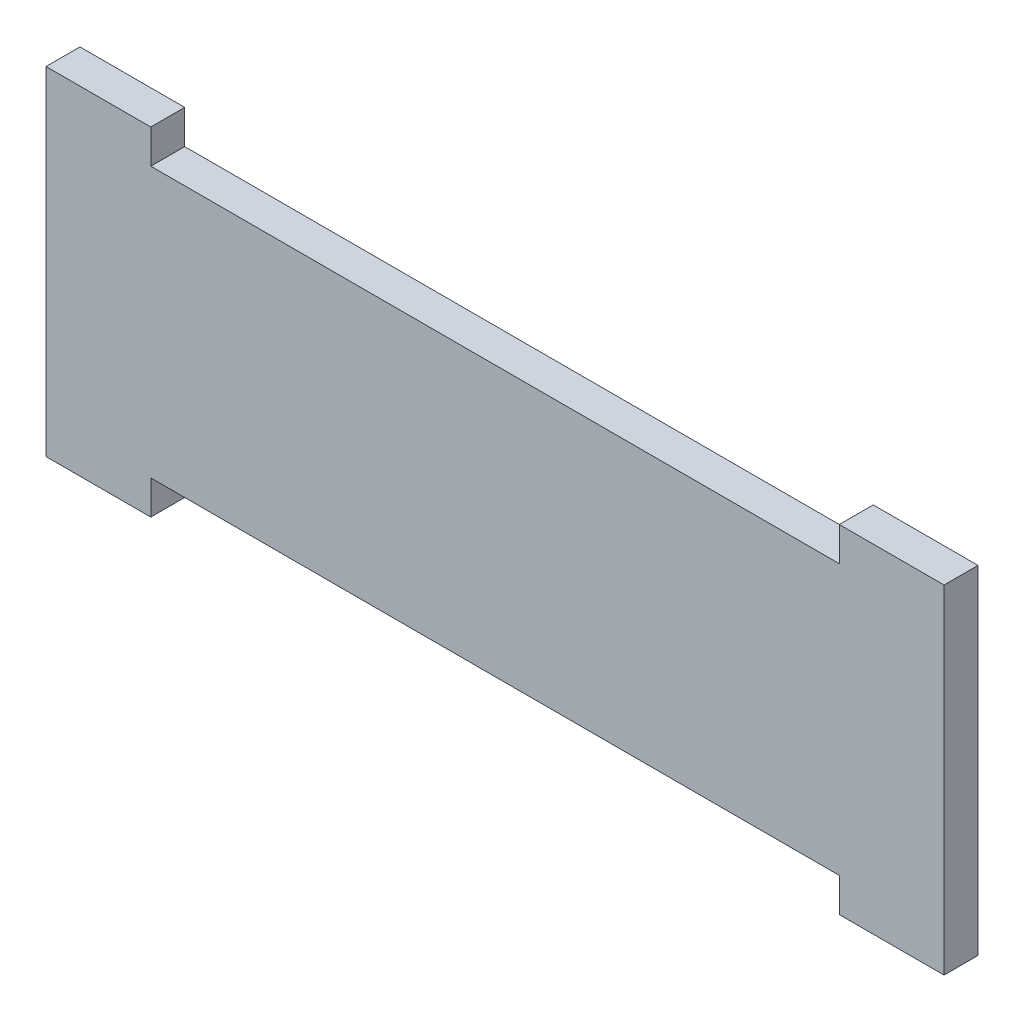
ISO-10303-21;
HEADER;
FILE_DESCRIPTION(('STEP AP214'),'2;1');
FILE_NAME('part.step','',(''),(''),'','','');
FILE_SCHEMA(('AUTOMOTIVE_DESIGN { 1 0 10303 214 1 1 1 1 }'));
ENDSEC;
DATA;
#1=APPLICATION_CONTEXT('core data for automotive mechanical design processes');
#2=APPLICATION_PROTOCOL_DEFINITION('international standard','automotive_design',2000,#1);
#3=PRODUCT_CONTEXT('',#1,'mechanical');
#4=PRODUCT('Part','Part','',(#3));
#5=PRODUCT_RELATED_PRODUCT_CATEGORY('part','',(#4));
#6=PRODUCT_DEFINITION_FORMATION('','',#4);
#7=PRODUCT_DEFINITION_CONTEXT('part definition',#1,'design');
#8=PRODUCT_DEFINITION('design','',#6,#7);
#9=PRODUCT_DEFINITION_SHAPE('','',#8);
#10=(LENGTH_UNIT() NAMED_UNIT(*) SI_UNIT(.MILLI.,.METRE.));
#11=(NAMED_UNIT(*) PLANE_ANGLE_UNIT() SI_UNIT($,.RADIAN.));
#12=(NAMED_UNIT(*) SI_UNIT($,.STERADIAN.) SOLID_ANGLE_UNIT());
#13=UNCERTAINTY_MEASURE_WITH_UNIT(LENGTH_MEASURE(1.E-05),#10,'distance_accuracy_value','');
#14=(GEOMETRIC_REPRESENTATION_CONTEXT(3) GLOBAL_UNCERTAINTY_ASSIGNED_CONTEXT((#13)) GLOBAL_UNIT_ASSIGNED_CONTEXT((#10,
#11,#12)) REPRESENTATION_CONTEXT('',''));
#15=CARTESIAN_POINT('',(0.,0.,0.));
#16=DIRECTION('',(0.,0.,1.));
#17=DIRECTION('',(1.,0.,0.));
#18=AXIS2_PLACEMENT_3D('',#15,#16,#17);
#19=CARTESIAN_POINT('',(-9.00000000000005,0.,1.5875));
#20=DIRECTION('',(1.,0.,0.));
#21=DIRECTION('',(0.,1.,0.));
#22=AXIS2_PLACEMENT_3D('',#19,#20,#21);
#23=PLANE('',#22);
#24=DIRECTION('',(0.,-1.,0.));
#25=VECTOR('',#24,1.);
#26=CARTESIAN_POINT('',(-9.00000000000005,0.,0.));
#27=LINE('',#26,#25);
#28=CARTESIAN_POINT('',(-9.00000000000004,0.,0.));
#29=VERTEX_POINT('',#28);
#30=CARTESIAN_POINT('',(-9.,-15.8,0.));
#31=VERTEX_POINT('',#30);
#32=EDGE_CURVE('E155',#29,#31,#27,.T.);
#33=ORIENTED_EDGE('',*,*,#32,.F.);
#34=DIRECTION('',(0.,0.,-1.));
#35=VECTOR('',#34,1.);
#36=CARTESIAN_POINT('',(-9.00000000000004,0.,1.5875));
#37=LINE('',#36,#35);
#38=CARTESIAN_POINT('',(-9.00000000000004,0.,1.5875));
#39=VERTEX_POINT('',#38);
#40=EDGE_CURVE('E11',#39,#29,#37,.T.);
#41=ORIENTED_EDGE('',*,*,#40,.F.);
#42=DIRECTION('',(0.,-1.,0.));
#43=VECTOR('',#42,1.);
#44=CARTESIAN_POINT('',(-9.00000000000005,0.,1.5875));
#45=LINE('',#44,#43);
#46=CARTESIAN_POINT('',(-9.,-15.8,1.5875));
#47=VERTEX_POINT('',#46);
#48=EDGE_CURVE('E184',#39,#47,#45,.T.);
#49=ORIENTED_EDGE('',*,*,#48,.T.);
#50=DIRECTION('',(0.,0.,-1.));
#51=VECTOR('',#50,1.);
#52=CARTESIAN_POINT('',(-9.,-15.8,1.5875));
#53=LINE('',#52,#51);
#54=EDGE_CURVE('E53',#47,#31,#53,.T.);
#55=ORIENTED_EDGE('',*,*,#54,.T.);
#56=EDGE_LOOP('',(#33,#41,#49,#55));
#57=FACE_BOUND('',#56,.T.);
#58=ADVANCED_FACE('F37',(#57),#23,.T.);
#59=CARTESIAN_POINT('',(0.,0.,1.5875));
#60=DIRECTION('',(0.,-1.,0.));
#61=DIRECTION('',(1.,0.,0.));
#62=AXIS2_PLACEMENT_3D('',#59,#60,#61);
#63=PLANE('',#62);
#64=DIRECTION('',(-1.,0.,0.));
#65=VECTOR('',#64,1.);
#66=CARTESIAN_POINT('',(0.,0.,0.));
#67=LINE('',#66,#65);
#68=CARTESIAN_POINT('',(-13.9,0.,0.));
#69=VERTEX_POINT('',#68);
#70=EDGE_CURVE('E157',#29,#69,#67,.T.);
#71=ORIENTED_EDGE('',*,*,#70,.T.);
#72=DIRECTION('',(0.,0.,-1.));
#73=VECTOR('',#72,1.);
#74=CARTESIAN_POINT('',(-13.9,0.,1.5875));
#75=LINE('',#74,#73);
#76=CARTESIAN_POINT('',(-13.9,0.,1.5875));
#77=VERTEX_POINT('',#76);
#78=EDGE_CURVE('E45',#77,#69,#75,.T.);
#79=ORIENTED_EDGE('',*,*,#78,.F.);
#80=DIRECTION('',(-1.,0.,0.));
#81=VECTOR('',#80,1.);
#82=CARTESIAN_POINT('',(0.,0.,1.5875));
#83=LINE('',#82,#81);
#84=EDGE_CURVE('E226',#39,#77,#83,.T.);
#85=ORIENTED_EDGE('',*,*,#84,.F.);
#86=ORIENTED_EDGE('',*,*,#40,.T.);
#87=EDGE_LOOP('',(#71,#79,#85,#86));
#88=FACE_BOUND('',#87,.T.);
#89=ADVANCED_FACE('F250',(#88),#63,.F.);
#90=CARTESIAN_POINT('',(-13.9,0.,1.5875));
#91=DIRECTION('',(1.,0.,0.));
#92=DIRECTION('',(0.,0.,-1.));
#93=AXIS2_PLACEMENT_3D('',#90,#91,#92);
#94=PLANE('',#93);
#95=DIRECTION('',(0.,-1.,0.));
#96=VECTOR('',#95,1.);
#97=CARTESIAN_POINT('',(-13.9,0.,0.));
#98=LINE('',#97,#96);
#99=CARTESIAN_POINT('',(-13.9,-1.58750000000001,0.));
#100=VERTEX_POINT('',#99);
#101=EDGE_CURVE('E159',#69,#100,#98,.T.);
#102=ORIENTED_EDGE('',*,*,#101,.T.);
#103=DIRECTION('',(0.,0.,-1.));
#104=VECTOR('',#103,1.);
#105=CARTESIAN_POINT('',(-13.9,-1.58750000000001,1.5875));
#106=LINE('',#105,#104);
#107=CARTESIAN_POINT('',(-13.9,-1.58750000000001,1.5875));
#108=VERTEX_POINT('',#107);
#109=EDGE_CURVE('E200',#108,#100,#106,.T.);
#110=ORIENTED_EDGE('',*,*,#109,.F.);
#111=DIRECTION('',(0.,-1.,0.));
#112=VECTOR('',#111,1.);
#113=CARTESIAN_POINT('',(-13.9,0.,1.5875));
#114=LINE('',#113,#112);
#115=EDGE_CURVE('E208',#77,#108,#114,.T.);
#116=ORIENTED_EDGE('',*,*,#115,.F.);
#117=ORIENTED_EDGE('',*,*,#78,.T.);
#118=EDGE_LOOP('',(#102,#110,#116,#117));
#119=FACE_BOUND('',#118,.T.);
#120=ADVANCED_FACE('F206',(#119),#94,.F.);
#121=CARTESIAN_POINT('',(0.,-1.58749999999993,1.5875));
#122=DIRECTION('',(0.,1.,0.));
#123=DIRECTION('',(-1.,0.,0.));
#124=AXIS2_PLACEMENT_3D('',#121,#122,#123);
#125=PLANE('',#124);
#126=DIRECTION('',(1.,0.,0.));
#127=VECTOR('',#126,1.);
#128=CARTESIAN_POINT('',(0.,-1.58749999999993,0.));
#129=LINE('',#128,#127);
#130=CARTESIAN_POINT('',(-46.1,-1.58750000000011,0.));
#131=VERTEX_POINT('',#130);
#132=EDGE_CURVE('E162',#131,#100,#129,.T.);
#133=ORIENTED_EDGE('',*,*,#132,.F.);
#134=DIRECTION('',(0.,0.,-1.));
#135=VECTOR('',#134,1.);
#136=CARTESIAN_POINT('',(-46.1,-1.58750000000011,1.5875));
#137=LINE('',#136,#135);
#138=CARTESIAN_POINT('',(-46.1,-1.58750000000011,1.5875));
#139=VERTEX_POINT('',#138);
#140=EDGE_CURVE('E198',#139,#131,#137,.T.);
#141=ORIENTED_EDGE('',*,*,#140,.F.);
#142=DIRECTION('',(1.,0.,0.));
#143=VECTOR('',#142,1.);
#144=CARTESIAN_POINT('',(0.,-1.58749999999993,1.5875));
#145=LINE('',#144,#143);
#146=EDGE_CURVE('E221',#139,#108,#145,.T.);
#147=ORIENTED_EDGE('',*,*,#146,.T.);
#148=ORIENTED_EDGE('',*,*,#109,.T.);
#149=EDGE_LOOP('',(#133,#141,#147,#148));
#150=FACE_BOUND('',#149,.T.);
#151=ADVANCED_FACE('F217',(#150),#125,.T.);
#152=CARTESIAN_POINT('',(-46.1,0.,1.5875));
#153=DIRECTION('',(-1.,0.,0.));
#154=DIRECTION('',(0.,0.,1.));
#155=AXIS2_PLACEMENT_3D('',#152,#153,#154);
#156=PLANE('',#155);
#157=DIRECTION('',(0.,1.,0.));
#158=VECTOR('',#157,1.);
#159=CARTESIAN_POINT('',(-46.1,0.,0.));
#160=LINE('',#159,#158);
#161=CARTESIAN_POINT('',(-46.1,0.,0.));
#162=VERTEX_POINT('',#161);
#163=EDGE_CURVE('E165',#131,#162,#160,.T.);
#164=ORIENTED_EDGE('',*,*,#163,.T.);
#165=DIRECTION('',(0.,0.,-1.));
#166=VECTOR('',#165,1.);
#167=CARTESIAN_POINT('',(-46.1,0.,1.5875));
#168=LINE('',#167,#166);
#169=CARTESIAN_POINT('',(-46.1,0.,1.5875));
#170=VERTEX_POINT('',#169);
#171=EDGE_CURVE('E195',#170,#162,#168,.T.);
#172=ORIENTED_EDGE('',*,*,#171,.F.);
#173=DIRECTION('',(0.,1.,0.));
#174=VECTOR('',#173,1.);
#175=CARTESIAN_POINT('',(-46.1,0.,1.5875));
#176=LINE('',#175,#174);
#177=EDGE_CURVE('E222',#139,#170,#176,.T.);
#178=ORIENTED_EDGE('',*,*,#177,.F.);
#179=ORIENTED_EDGE('',*,*,#140,.T.);
#180=EDGE_LOOP('',(#164,#172,#178,#179));
#181=FACE_BOUND('',#180,.T.);
#182=ADVANCED_FACE('F261',(#181),#156,.F.);
#183=CARTESIAN_POINT('',(0.,-3.08877976342309E-13,1.5875));
#184=DIRECTION('',(0.,-1.,0.));
#185=DIRECTION('',(1.,0.,0.));
#186=AXIS2_PLACEMENT_3D('',#183,#184,#185);
#187=PLANE('',#186);
#188=DIRECTION('',(-1.,0.,0.));
#189=VECTOR('',#188,1.);
#190=CARTESIAN_POINT('',(0.,-3.08877976342309E-13,0.));
#191=LINE('',#190,#189);
#192=CARTESIAN_POINT('',(-51.,0.,0.));
#193=VERTEX_POINT('',#192);
#194=EDGE_CURVE('E167',#162,#193,#191,.T.);
#195=ORIENTED_EDGE('',*,*,#194,.T.);
#196=DIRECTION('',(0.,0.,-1.));
#197=VECTOR('',#196,1.);
#198=CARTESIAN_POINT('',(-51.,0.,1.5875));
#199=LINE('',#198,#197);
#200=CARTESIAN_POINT('',(-51.,0.,1.5875));
#201=VERTEX_POINT('',#200);
#202=EDGE_CURVE('E192',#201,#193,#199,.T.);
#203=ORIENTED_EDGE('',*,*,#202,.F.);
#204=DIRECTION('',(-1.,0.,0.));
#205=VECTOR('',#204,1.);
#206=CARTESIAN_POINT('',(0.,-3.08877976342309E-13,1.5875));
#207=LINE('',#206,#205);
#208=EDGE_CURVE('E224',#170,#201,#207,.T.);
#209=ORIENTED_EDGE('',*,*,#208,.F.);
#210=ORIENTED_EDGE('',*,*,#171,.T.);
#211=EDGE_LOOP('',(#195,#203,#209,#210));
#212=FACE_BOUND('',#211,.T.);
#213=ADVANCED_FACE('F264',(#212),#187,.F.);
#214=CARTESIAN_POINT('',(-51.,0.,1.5875));
#215=DIRECTION('',(1.,0.,0.));
#216=DIRECTION('',(0.,0.,-1.));
#217=AXIS2_PLACEMENT_3D('',#214,#215,#216);
#218=PLANE('',#217);
#219=DIRECTION('',(0.,-1.,0.));
#220=VECTOR('',#219,1.);
#221=CARTESIAN_POINT('',(-51.,0.,0.));
#222=LINE('',#221,#220);
#223=CARTESIAN_POINT('',(-51.,-15.8,0.));
#224=VERTEX_POINT('',#223);
#225=EDGE_CURVE('E169',#193,#224,#222,.T.);
#226=ORIENTED_EDGE('',*,*,#225,.T.);
#227=DIRECTION('',(0.,0.,-1.));
#228=VECTOR('',#227,1.);
#229=CARTESIAN_POINT('',(-51.,-15.8,1.5875));
#230=LINE('',#229,#228);
#231=CARTESIAN_POINT('',(-51.,-15.8,1.5875));
#232=VERTEX_POINT('',#231);
#233=EDGE_CURVE('E190',#232,#224,#230,.T.);
#234=ORIENTED_EDGE('',*,*,#233,.F.);
#235=DIRECTION('',(0.,-1.,0.));
#236=VECTOR('',#235,1.);
#237=CARTESIAN_POINT('',(-51.,0.,1.5875));
#238=LINE('',#237,#236);
#239=EDGE_CURVE('E231',#201,#232,#238,.T.);
#240=ORIENTED_EDGE('',*,*,#239,.F.);
#241=ORIENTED_EDGE('',*,*,#202,.T.);
#242=EDGE_LOOP('',(#226,#234,#240,#241));
#243=FACE_BOUND('',#242,.T.);
#244=ADVANCED_FACE('F268',(#243),#218,.F.);
#245=CARTESIAN_POINT('',(0.,-15.7999999999999,1.5875));
#246=DIRECTION('',(0.,-1.,0.));
#247=DIRECTION('',(1.,0.,0.));
#248=AXIS2_PLACEMENT_3D('',#245,#246,#247);
#249=PLANE('',#248);
#250=DIRECTION('',(-1.,0.,0.));
#251=VECTOR('',#250,1.);
#252=CARTESIAN_POINT('',(0.,-15.7999999999999,0.));
#253=LINE('',#252,#251);
#254=CARTESIAN_POINT('',(-46.1,-15.8,0.));
#255=VERTEX_POINT('',#254);
#256=EDGE_CURVE('E172',#255,#224,#253,.T.);
#257=ORIENTED_EDGE('',*,*,#256,.F.);
#258=DIRECTION('',(0.,0.,-1.));
#259=VECTOR('',#258,1.);
#260=CARTESIAN_POINT('',(-46.1,-15.8,1.5875));
#261=LINE('',#260,#259);
#262=CARTESIAN_POINT('',(-46.1,-15.8,1.5875));
#263=VERTEX_POINT('',#262);
#264=EDGE_CURVE('E188',#263,#255,#261,.T.);
#265=ORIENTED_EDGE('',*,*,#264,.F.);
#266=DIRECTION('',(-1.,0.,0.));
#267=VECTOR('',#266,1.);
#268=CARTESIAN_POINT('',(0.,-15.7999999999999,1.5875));
#269=LINE('',#268,#267);
#270=EDGE_CURVE('E233',#263,#232,#269,.T.);
#271=ORIENTED_EDGE('',*,*,#270,.T.);
#272=ORIENTED_EDGE('',*,*,#233,.T.);
#273=EDGE_LOOP('',(#257,#265,#271,#272));
#274=FACE_BOUND('',#273,.T.);
#275=ADVANCED_FACE('F272',(#274),#249,.T.);
#276=CARTESIAN_POINT('',(-46.1,0.,1.5875));
#277=DIRECTION('',(1.,0.,0.));
#278=DIRECTION('',(0.,0.,-1.));
#279=AXIS2_PLACEMENT_3D('',#276,#277,#278);
#280=PLANE('',#279);
#281=DIRECTION('',(0.,-1.,0.));
#282=VECTOR('',#281,1.);
#283=CARTESIAN_POINT('',(-46.1,0.,0.));
#284=LINE('',#283,#282);
#285=CARTESIAN_POINT('',(-46.1,-14.2125,0.));
#286=VERTEX_POINT('',#285);
#287=EDGE_CURVE('E175',#286,#255,#284,.T.);
#288=ORIENTED_EDGE('',*,*,#287,.F.);
#289=DIRECTION('',(0.,0.,-1.));
#290=VECTOR('',#289,1.);
#291=CARTESIAN_POINT('',(-46.1,-14.2125,1.5875));
#292=LINE('',#291,#290);
#293=CARTESIAN_POINT('',(-46.1,-14.2125,1.5875));
#294=VERTEX_POINT('',#293);
#295=EDGE_CURVE('E136',#294,#286,#292,.T.);
#296=ORIENTED_EDGE('',*,*,#295,.F.);
#297=DIRECTION('',(0.,-1.,0.));
#298=VECTOR('',#297,1.);
#299=CARTESIAN_POINT('',(-46.1,0.,1.5875));
#300=LINE('',#299,#298);
#301=EDGE_CURVE('E147',#294,#263,#300,.T.);
#302=ORIENTED_EDGE('',*,*,#301,.T.);
#303=ORIENTED_EDGE('',*,*,#264,.T.);
#304=EDGE_LOOP('',(#288,#296,#302,#303));
#305=FACE_BOUND('',#304,.T.);
#306=ADVANCED_FACE('F237',(#305),#280,.T.);
#307=CARTESIAN_POINT('',(0.,-14.2125,1.5875));
#308=DIRECTION('',(0.,-1.,0.));
#309=DIRECTION('',(0.,0.,-1.));
#310=AXIS2_PLACEMENT_3D('',#307,#308,#309);
#311=PLANE('',#310);
#312=DIRECTION('',(-1.,0.,0.));
#313=VECTOR('',#312,1.);
#314=CARTESIAN_POINT('',(0.,-14.2125,0.));
#315=LINE('',#314,#313);
#316=CARTESIAN_POINT('',(-13.9,-14.2125,0.));
#317=VERTEX_POINT('',#316);
#318=EDGE_CURVE('E132',#317,#286,#315,.T.);
#319=ORIENTED_EDGE('',*,*,#318,.F.);
#320=DIRECTION('',(0.,0.,-1.));
#321=VECTOR('',#320,1.);
#322=CARTESIAN_POINT('',(-13.9,-14.2125,1.5875));
#323=LINE('',#322,#321);
#324=CARTESIAN_POINT('',(-13.9,-14.2125,1.5875));
#325=VERTEX_POINT('',#324);
#326=EDGE_CURVE('E127',#325,#317,#323,.T.);
#327=ORIENTED_EDGE('',*,*,#326,.F.);
#328=DIRECTION('',(-1.,0.,0.));
#329=VECTOR('',#328,1.);
#330=CARTESIAN_POINT('',(0.,-14.2125,1.5875));
#331=LINE('',#330,#329);
#332=EDGE_CURVE('E130',#325,#294,#331,.T.);
#333=ORIENTED_EDGE('',*,*,#332,.T.);
#334=ORIENTED_EDGE('',*,*,#295,.T.);
#335=EDGE_LOOP('',(#319,#327,#333,#334));
#336=FACE_BOUND('',#335,.T.);
#337=ADVANCED_FACE('F129',(#336),#311,.T.);
#338=CARTESIAN_POINT('',(-13.9,0.,1.5875));
#339=DIRECTION('',(-1.,0.,0.));
#340=DIRECTION('',(0.,0.,1.));
#341=AXIS2_PLACEMENT_3D('',#338,#339,#340);
#342=PLANE('',#341);
#343=DIRECTION('',(0.,1.,0.));
#344=VECTOR('',#343,1.);
#345=CARTESIAN_POINT('',(-13.9,0.,0.));
#346=LINE('',#345,#344);
#347=CARTESIAN_POINT('',(-13.9,-15.8,0.));
#348=VERTEX_POINT('',#347);
#349=EDGE_CURVE('E179',#348,#317,#346,.T.);
#350=ORIENTED_EDGE('',*,*,#349,.F.);
#351=DIRECTION('',(0.,0.,-1.));
#352=VECTOR('',#351,1.);
#353=CARTESIAN_POINT('',(-13.9,-15.8,1.5875));
#354=LINE('',#353,#352);
#355=CARTESIAN_POINT('',(-13.9,-15.8,1.5875));
#356=VERTEX_POINT('',#355);
#357=EDGE_CURVE('E90',#356,#348,#354,.T.);
#358=ORIENTED_EDGE('',*,*,#357,.F.);
#359=DIRECTION('',(0.,1.,0.));
#360=VECTOR('',#359,1.);
#361=CARTESIAN_POINT('',(-13.9,0.,1.5875));
#362=LINE('',#361,#360);
#363=EDGE_CURVE('E144',#356,#325,#362,.T.);
#364=ORIENTED_EDGE('',*,*,#363,.T.);
#365=ORIENTED_EDGE('',*,*,#326,.T.);
#366=EDGE_LOOP('',(#350,#358,#364,#365));
#367=FACE_BOUND('',#366,.T.);
#368=ADVANCED_FACE('F149',(#367),#342,.T.);
#369=CARTESIAN_POINT('',(0.,-15.8,1.5875));
#370=DIRECTION('',(0.,-1.,0.));
#371=DIRECTION('',(1.,0.,0.));
#372=AXIS2_PLACEMENT_3D('',#369,#370,#371);
#373=PLANE('',#372);
#374=DIRECTION('',(-1.,0.,0.));
#375=VECTOR('',#374,1.);
#376=CARTESIAN_POINT('',(0.,-15.8,0.));
#377=LINE('',#376,#375);
#378=EDGE_CURVE('E181',#31,#348,#377,.T.);
#379=ORIENTED_EDGE('',*,*,#378,.F.);
#380=ORIENTED_EDGE('',*,*,#54,.F.);
#381=DIRECTION('',(-1.,0.,0.));
#382=VECTOR('',#381,1.);
#383=CARTESIAN_POINT('',(0.,-15.8,1.5875));
#384=LINE('',#383,#382);
#385=EDGE_CURVE('E150',#47,#356,#384,.T.);
#386=ORIENTED_EDGE('',*,*,#385,.T.);
#387=ORIENTED_EDGE('',*,*,#357,.T.);
#388=EDGE_LOOP('',(#379,#380,#386,#387));
#389=FACE_BOUND('',#388,.T.);
#390=ADVANCED_FACE('F239',(#389),#373,.T.);
#391=CARTESIAN_POINT('',(0.,0.,1.5875));
#392=DIRECTION('',(0.,0.,1.));
#393=DIRECTION('',(1.,0.,0.));
#394=AXIS2_PLACEMENT_3D('',#391,#392,#393);
#395=PLANE('',#394);
#396=ORIENTED_EDGE('',*,*,#48,.F.);
#397=ORIENTED_EDGE('',*,*,#84,.T.);
#398=ORIENTED_EDGE('',*,*,#115,.T.);
#399=ORIENTED_EDGE('',*,*,#146,.F.);
#400=ORIENTED_EDGE('',*,*,#177,.T.);
#401=ORIENTED_EDGE('',*,*,#208,.T.);
#402=ORIENTED_EDGE('',*,*,#239,.T.);
#403=ORIENTED_EDGE('',*,*,#270,.F.);
#404=ORIENTED_EDGE('',*,*,#301,.F.);
#405=ORIENTED_EDGE('',*,*,#332,.F.);
#406=ORIENTED_EDGE('',*,*,#363,.F.);
#407=ORIENTED_EDGE('',*,*,#385,.F.);
#408=EDGE_LOOP('',(#396,#397,#398,#399,#400,#401,#402,#403,#404,#405,#406,#407));
#409=FACE_BOUND('',#408,.T.);
#410=ADVANCED_FACE('F142',(#409),#395,.T.);
#411=CARTESIAN_POINT('',(0.,0.,0.));
#412=DIRECTION('',(0.,0.,1.));
#413=DIRECTION('',(1.,0.,0.));
#414=AXIS2_PLACEMENT_3D('',#411,#412,#413);
#415=PLANE('',#414);
#416=ORIENTED_EDGE('',*,*,#32,.T.);
#417=ORIENTED_EDGE('',*,*,#378,.T.);
#418=ORIENTED_EDGE('',*,*,#349,.T.);
#419=ORIENTED_EDGE('',*,*,#318,.T.);
#420=ORIENTED_EDGE('',*,*,#287,.T.);
#421=ORIENTED_EDGE('',*,*,#256,.T.);
#422=ORIENTED_EDGE('',*,*,#225,.F.);
#423=ORIENTED_EDGE('',*,*,#194,.F.);
#424=ORIENTED_EDGE('',*,*,#163,.F.);
#425=ORIENTED_EDGE('',*,*,#132,.T.);
#426=ORIENTED_EDGE('',*,*,#101,.F.);
#427=ORIENTED_EDGE('',*,*,#70,.F.);
#428=EDGE_LOOP('',(#416,#417,#418,#419,#420,#421,#422,#423,#424,#425,#426,#427));
#429=FACE_BOUND('',#428,.T.);
#430=ADVANCED_FACE('F212',(#429),#415,.F.);
#431=CLOSED_SHELL('',(#58,#89,#120,#151,#182,#213,#244,#275,#306,#337,#368,#390,#410,#430));
#432=MANIFOLD_SOLID_BREP('B2',#431);
#433=ADVANCED_BREP_SHAPE_REPRESENTATION('',(#18,#432),#14);
#434=SHAPE_DEFINITION_REPRESENTATION(#9,#433);
ENDSEC;
END-ISO-10303-21;
